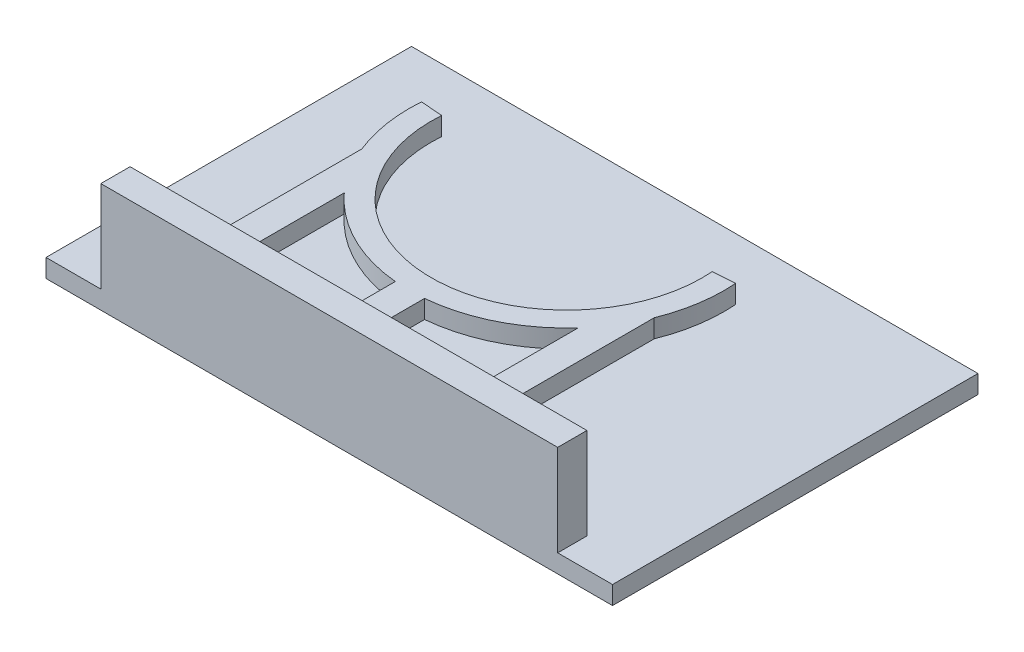
ISO-10303-21;
HEADER;
FILE_DESCRIPTION(('STEP AP214'),'2;1');
FILE_NAME('part.step','',(''),(''),'','','');
FILE_SCHEMA(('AUTOMOTIVE_DESIGN { 1 0 10303 214 1 1 1 1 }'));
ENDSEC;
DATA;
#1=APPLICATION_CONTEXT('core data for automotive mechanical design processes');
#2=APPLICATION_PROTOCOL_DEFINITION('international standard','automotive_design',2000,#1);
#3=PRODUCT_CONTEXT('',#1,'mechanical');
#4=PRODUCT('Part','Part','',(#3));
#5=PRODUCT_RELATED_PRODUCT_CATEGORY('part','',(#4));
#6=PRODUCT_DEFINITION_FORMATION('','',#4);
#7=PRODUCT_DEFINITION_CONTEXT('part definition',#1,'design');
#8=PRODUCT_DEFINITION('design','',#6,#7);
#9=PRODUCT_DEFINITION_SHAPE('','',#8);
#10=(LENGTH_UNIT() NAMED_UNIT(*) SI_UNIT(.MILLI.,.METRE.));
#11=(NAMED_UNIT(*) PLANE_ANGLE_UNIT() SI_UNIT($,.RADIAN.));
#12=(NAMED_UNIT(*) SI_UNIT($,.STERADIAN.) SOLID_ANGLE_UNIT());
#13=UNCERTAINTY_MEASURE_WITH_UNIT(LENGTH_MEASURE(1.E-05),#10,'distance_accuracy_value','');
#14=(GEOMETRIC_REPRESENTATION_CONTEXT(3) GLOBAL_UNCERTAINTY_ASSIGNED_CONTEXT((#13)) GLOBAL_UNIT_ASSIGNED_CONTEXT((#10,
#11,#12)) REPRESENTATION_CONTEXT('',''));
#15=CARTESIAN_POINT('',(0.,0.,0.));
#16=DIRECTION('',(0.,0.,1.));
#17=DIRECTION('',(1.,0.,0.));
#18=AXIS2_PLACEMENT_3D('',#15,#16,#17);
#19=CARTESIAN_POINT('',(77.4999999999999,25.,-65.));
#20=DIRECTION('',(0.,-1.,0.));
#21=DIRECTION('',(0.,0.,-1.));
#22=AXIS2_PLACEMENT_3D('',#19,#20,#21);
#23=CYLINDRICAL_SURFACE('',#22,43.1123422402481);
#24=DIRECTION('',(0.,-1.,0.));
#25=VECTOR('',#24,1.);
#26=CARTESIAN_POINT('',(81.4999999999999,25.,-22.073620541207));
#27=LINE('',#26,#25);
#28=CARTESIAN_POINT('',(81.4999999999999,25.,-22.073620541207));
#29=VERTEX_POINT('',#28);
#30=CARTESIAN_POINT('',(81.4999999999999,20.,-22.0736205412209));
#31=VERTEX_POINT('',#30);
#32=EDGE_CURVE('E282',#29,#31,#27,.T.);
#33=ORIENTED_EDGE('',*,*,#32,.T.);
#34=CARTESIAN_POINT('',(77.4999999999999,20.,-65.));
#35=DIRECTION('',(0.,1.,0.));
#36=DIRECTION('',(0.,0.,1.));
#37=AXIS2_PLACEMENT_3D('',#34,#35,#36);
#38=CIRCLE('',#37,43.1123422402481);
#39=CARTESIAN_POINT('',(109.499999999975,20.,-36.1092739198057));
#40=VERTEX_POINT('',#39);
#41=EDGE_CURVE('E218',#31,#40,#38,.T.);
#42=ORIENTED_EDGE('',*,*,#41,.T.);
#43=DIRECTION('',(0.,-1.,0.));
#44=VECTOR('',#43,1.);
#45=CARTESIAN_POINT('',(109.499999999975,25.,-36.1092739197878));
#46=LINE('',#45,#44);
#47=CARTESIAN_POINT('',(109.499999999975,25.,-36.1092739197878));
#48=VERTEX_POINT('',#47);
#49=EDGE_CURVE('E230',#40,#48,#46,.F.);
#50=ORIENTED_EDGE('',*,*,#49,.T.);
#51=CARTESIAN_POINT('',(77.4999999999999,25.,-65.));
#52=DIRECTION('',(0.,1.,0.));
#53=DIRECTION('',(0.,0.,1.));
#54=AXIS2_PLACEMENT_3D('',#51,#52,#53);
#55=CIRCLE('',#54,43.1123422402481);
#56=EDGE_CURVE('E301',#29,#48,#55,.T.);
#57=ORIENTED_EDGE('',*,*,#56,.F.);
#58=EDGE_LOOP('',(#33,#42,#50,#57));
#59=FACE_BOUND('',#58,.T.);
#60=ADVANCED_FACE('F41',(#59),#23,.T.);
#61=DIRECTION('',(0.,-1.,0.));
#62=VECTOR('',#61,1.);
#63=CARTESIAN_POINT('',(117.499999999975,25.,-48.9166529154456));
#64=LINE('',#63,#62);
#65=CARTESIAN_POINT('',(117.499999999975,25.,-48.9166529154456));
#66=VERTEX_POINT('',#65);
#67=CARTESIAN_POINT('',(117.499999999975,20.,-48.9166529154659));
#68=VERTEX_POINT('',#67);
#69=EDGE_CURVE('E223',#66,#68,#64,.T.);
#70=ORIENTED_EDGE('',*,*,#69,.T.);
#71=CARTESIAN_POINT('',(120.49159792965,20.,-68.224369844725));
#72=VERTEX_POINT('',#71);
#73=EDGE_CURVE('E203',#68,#72,#38,.T.);
#74=ORIENTED_EDGE('',*,*,#73,.T.);
#75=DIRECTION('',(0.,-1.,0.));
#76=VECTOR('',#75,1.);
#77=CARTESIAN_POINT('',(120.49159792965,25.,-68.224369844725));
#78=LINE('',#77,#76);
#79=CARTESIAN_POINT('',(120.49159792965,25.,-68.224369844725));
#80=VERTEX_POINT('',#79);
#81=EDGE_CURVE('E316',#80,#72,#78,.T.);
#82=ORIENTED_EDGE('',*,*,#81,.F.);
#83=EDGE_CURVE('E229',#66,#80,#55,.T.);
#84=ORIENTED_EDGE('',*,*,#83,.F.);
#85=EDGE_LOOP('',(#70,#74,#82,#84));
#86=FACE_BOUND('',#85,.T.);
#87=ADVANCED_FACE('F228',(#86),#23,.T.);
#88=DIRECTION('',(0.,-1.,0.));
#89=VECTOR('',#88,1.);
#90=CARTESIAN_POINT('',(34.5084020703496,25.,-68.224369844725));
#91=LINE('',#90,#89);
#92=CARTESIAN_POINT('',(34.5084020703496,25.,-68.224369844725));
#93=VERTEX_POINT('',#92);
#94=CARTESIAN_POINT('',(34.5084020703496,20.,-68.224369844725));
#95=VERTEX_POINT('',#94);
#96=EDGE_CURVE('E307',#93,#95,#91,.T.);
#97=ORIENTED_EDGE('',*,*,#96,.T.);
#98=CARTESIAN_POINT('',(37.4999999999999,20.,-48.9166529155065));
#99=VERTEX_POINT('',#98);
#100=EDGE_CURVE('E58',#95,#99,#38,.T.);
#101=ORIENTED_EDGE('',*,*,#100,.T.);
#102=DIRECTION('',(0.,-1.,0.));
#103=VECTOR('',#102,1.);
#104=CARTESIAN_POINT('',(37.4999999999999,25.,-48.9166529155065));
#105=LINE('',#104,#103);
#106=CARTESIAN_POINT('',(37.4999999999999,25.0000000000313,-48.9166529155065));
#107=VERTEX_POINT('',#106);
#108=EDGE_CURVE('E260',#99,#107,#105,.F.);
#109=ORIENTED_EDGE('',*,*,#108,.T.);
#110=EDGE_CURVE('E296',#93,#107,#55,.T.);
#111=ORIENTED_EDGE('',*,*,#110,.F.);
#112=EDGE_LOOP('',(#97,#101,#109,#111));
#113=FACE_BOUND('',#112,.T.);
#114=ADVANCED_FACE('F446',(#113),#23,.T.);
#115=CARTESIAN_POINT('',(14.9999999999999,30.,-8.));
#116=DIRECTION('',(0.,0.,1.));
#117=DIRECTION('',(1.,0.,0.));
#118=AXIS2_PLACEMENT_3D('',#115,#116,#117);
#119=PLANE('',#118);
#120=DIRECTION('',(-1.,0.,0.));
#121=VECTOR('',#120,1.);
#122=CARTESIAN_POINT('',(117.499999999975,20.,-8.));
#123=LINE('',#122,#121);
#124=CARTESIAN_POINT('',(117.499999999975,20.,-8.));
#125=VERTEX_POINT('',#124);
#126=CARTESIAN_POINT('',(109.499999999975,20.,-8.));
#127=VERTEX_POINT('',#126);
#128=EDGE_CURVE('E479',#125,#127,#123,.T.);
#129=ORIENTED_EDGE('',*,*,#128,.F.);
#130=DIRECTION('',(0.,-1.,0.));
#131=VECTOR('',#130,1.);
#132=CARTESIAN_POINT('',(117.499999999975,25.,-8.));
#133=LINE('',#132,#131);
#134=CARTESIAN_POINT('',(117.499999999975,25.,-8.));
#135=VERTEX_POINT('',#134);
#136=EDGE_CURVE('E225',#135,#125,#133,.T.);
#137=ORIENTED_EDGE('',*,*,#136,.F.);
#138=DIRECTION('',(1.,0.,0.));
#139=VECTOR('',#138,1.);
#140=CARTESIAN_POINT('',(117.499999999975,25.,-8.));
#141=LINE('',#140,#139);
#142=CARTESIAN_POINT('',(109.499999999975,25.,-8.));
#143=VERTEX_POINT('',#142);
#144=EDGE_CURVE('E66',#143,#135,#141,.T.);
#145=ORIENTED_EDGE('',*,*,#144,.F.);
#146=DIRECTION('',(0.,1.,0.));
#147=VECTOR('',#146,1.);
#148=CARTESIAN_POINT('',(109.499999999975,25.,-8.));
#149=LINE('',#148,#147);
#150=EDGE_CURVE('E481',#127,#143,#149,.T.);
#151=ORIENTED_EDGE('',*,*,#150,.F.);
#152=EDGE_LOOP('',(#129,#137,#145,#151));
#153=FACE_BOUND('',#152,.T.);
#154=DIRECTION('',(-1.,0.,0.));
#155=VECTOR('',#154,1.);
#156=CARTESIAN_POINT('',(81.4999999999999,20.,-8.));
#157=LINE('',#156,#155);
#158=CARTESIAN_POINT('',(81.4999999999999,20.,-8.));
#159=VERTEX_POINT('',#158);
#160=CARTESIAN_POINT('',(73.4999999999999,20.,-8.));
#161=VERTEX_POINT('',#160);
#162=EDGE_CURVE('E267',#159,#161,#157,.T.);
#163=ORIENTED_EDGE('',*,*,#162,.F.);
#164=DIRECTION('',(0.,-1.,0.));
#165=VECTOR('',#164,1.);
#166=CARTESIAN_POINT('',(81.4999999999999,25.,-8.));
#167=LINE('',#166,#165);
#168=CARTESIAN_POINT('',(81.4999999999999,25.,-8.));
#169=VERTEX_POINT('',#168);
#170=EDGE_CURVE('E264',#169,#159,#167,.T.);
#171=ORIENTED_EDGE('',*,*,#170,.F.);
#172=DIRECTION('',(1.,0.,0.));
#173=VECTOR('',#172,1.);
#174=CARTESIAN_POINT('',(81.4999999999999,25.,-8.));
#175=LINE('',#174,#173);
#176=CARTESIAN_POINT('',(73.4999999999999,25.,-8.));
#177=VERTEX_POINT('',#176);
#178=EDGE_CURVE('E273',#177,#169,#175,.T.);
#179=ORIENTED_EDGE('',*,*,#178,.F.);
#180=DIRECTION('',(0.,1.,0.));
#181=VECTOR('',#180,1.);
#182=CARTESIAN_POINT('',(73.4999999999999,25.,-8.));
#183=LINE('',#182,#181);
#184=EDGE_CURVE('E270',#161,#177,#183,.T.);
#185=ORIENTED_EDGE('',*,*,#184,.F.);
#186=EDGE_LOOP('',(#163,#171,#179,#185));
#187=FACE_BOUND('',#186,.T.);
#188=DIRECTION('',(-1.,0.,0.));
#189=VECTOR('',#188,1.);
#190=CARTESIAN_POINT('',(37.4999999999999,20.,-8.));
#191=LINE('',#190,#189);
#192=CARTESIAN_POINT('',(45.5000000000554,20.,-8.));
#193=VERTEX_POINT('',#192);
#194=CARTESIAN_POINT('',(37.4999999999999,20.,-8.));
#195=VERTEX_POINT('',#194);
#196=EDGE_CURVE('E244',#193,#195,#191,.T.);
#197=ORIENTED_EDGE('',*,*,#196,.F.);
#198=DIRECTION('',(0.,-1.,0.));
#199=VECTOR('',#198,1.);
#200=CARTESIAN_POINT('',(45.5000000000554,25.0000000000313,-8.));
#201=LINE('',#200,#199);
#202=CARTESIAN_POINT('',(45.5000000000554,25.0000000000313,-8.));
#203=VERTEX_POINT('',#202);
#204=EDGE_CURVE('E241',#203,#193,#201,.T.);
#205=ORIENTED_EDGE('',*,*,#204,.F.);
#206=DIRECTION('',(1.,0.,0.));
#207=VECTOR('',#206,1.);
#208=CARTESIAN_POINT('',(37.4999999999999,25.0000000000313,-8.));
#209=LINE('',#208,#207);
#210=CARTESIAN_POINT('',(37.4999999999999,25.0000000000313,-8.));
#211=VERTEX_POINT('',#210);
#212=EDGE_CURVE('E237',#211,#203,#209,.T.);
#213=ORIENTED_EDGE('',*,*,#212,.F.);
#214=DIRECTION('',(0.,1.,0.));
#215=VECTOR('',#214,1.);
#216=CARTESIAN_POINT('',(37.4999999999999,25.0000000000313,-8.));
#217=LINE('',#216,#215);
#218=EDGE_CURVE('E233',#195,#211,#217,.T.);
#219=ORIENTED_EDGE('',*,*,#218,.F.);
#220=EDGE_LOOP('',(#197,#205,#213,#219));
#221=FACE_BOUND('',#220,.T.);
#222=DIRECTION('',(0.,-1.,0.));
#223=VECTOR('',#222,1.);
#224=CARTESIAN_POINT('',(140.,30.,-8.));
#225=LINE('',#224,#223);
#226=CARTESIAN_POINT('',(140.,30.,-8.));
#227=VERTEX_POINT('',#226);
#228=CARTESIAN_POINT('',(140.,5.,-8.));
#229=VERTEX_POINT('',#228);
#230=EDGE_CURVE('E338',#227,#229,#225,.T.);
#231=ORIENTED_EDGE('',*,*,#230,.T.);
#232=DIRECTION('',(-1.,0.,0.));
#233=VECTOR('',#232,1.);
#234=CARTESIAN_POINT('',(14.9999999999999,5.,-8.));
#235=LINE('',#234,#233);
#236=CARTESIAN_POINT('',(14.9999999999999,5.,-8.));
#237=VERTEX_POINT('',#236);
#238=EDGE_CURVE('E323',#229,#237,#235,.T.);
#239=ORIENTED_EDGE('',*,*,#238,.T.);
#240=DIRECTION('',(0.,-1.,0.));
#241=VECTOR('',#240,1.);
#242=CARTESIAN_POINT('',(14.9999999999999,30.,-8.));
#243=LINE('',#242,#241);
#244=CARTESIAN_POINT('',(14.9999999999999,30.,-8.));
#245=VERTEX_POINT('',#244);
#246=EDGE_CURVE('E329',#245,#237,#243,.T.);
#247=ORIENTED_EDGE('',*,*,#246,.F.);
#248=DIRECTION('',(-1.,0.,0.));
#249=VECTOR('',#248,1.);
#250=CARTESIAN_POINT('',(14.9999999999999,30.,-8.));
#251=LINE('',#250,#249);
#252=EDGE_CURVE('E327',#227,#245,#251,.T.);
#253=ORIENTED_EDGE('',*,*,#252,.F.);
#254=EDGE_LOOP('',(#231,#239,#247,#253));
#255=FACE_BOUND('',#254,.T.);
#256=ADVANCED_FACE('F451',(#153,#187,#221,#255),#119,.F.);
#257=DIRECTION('',(0.,-1.,0.));
#258=VECTOR('',#257,1.);
#259=CARTESIAN_POINT('',(45.5000000000554,25.,-36.1092739197535));
#260=LINE('',#259,#258);
#261=CARTESIAN_POINT('',(45.5000000000554,25.,-36.1092739197535));
#262=VERTEX_POINT('',#261);
#263=CARTESIAN_POINT('',(45.5000000000554,20.,-36.1092739197488));
#264=VERTEX_POINT('',#263);
#265=EDGE_CURVE('E261',#262,#264,#260,.T.);
#266=ORIENTED_EDGE('',*,*,#265,.T.);
#267=CARTESIAN_POINT('',(73.4999999999986,20.,-22.0736205412071));
#268=VERTEX_POINT('',#267);
#269=EDGE_CURVE('E475',#264,#268,#38,.T.);
#270=ORIENTED_EDGE('',*,*,#269,.T.);
#271=DIRECTION('',(0.,-1.,0.));
#272=VECTOR('',#271,1.);
#273=CARTESIAN_POINT('',(73.4999999999999,25.,-22.073620541207));
#274=LINE('',#273,#272);
#275=CARTESIAN_POINT('',(73.4999999999999,25.,-22.073620541207));
#276=VERTEX_POINT('',#275);
#277=EDGE_CURVE('E291',#268,#276,#274,.F.);
#278=ORIENTED_EDGE('',*,*,#277,.T.);
#279=EDGE_CURVE('E300',#262,#276,#55,.T.);
#280=ORIENTED_EDGE('',*,*,#279,.F.);
#281=EDGE_LOOP('',(#266,#270,#278,#280));
#282=FACE_BOUND('',#281,.T.);
#283=ADVANCED_FACE('F442',(#282),#23,.T.);
#284=CARTESIAN_POINT('',(0.,5.,0.));
#285=DIRECTION('',(0.,-1.,0.));
#286=DIRECTION('',(0.,0.,-1.));
#287=AXIS2_PLACEMENT_3D('',#284,#285,#286);
#288=PLANE('',#287);
#289=DIRECTION('',(0.,0.,1.));
#290=VECTOR('',#289,1.);
#291=CARTESIAN_POINT('',(14.9999999999999,5.,0.));
#292=LINE('',#291,#290);
#293=CARTESIAN_POINT('',(14.9999999999999,5.,0.));
#294=VERTEX_POINT('',#293);
#295=EDGE_CURVE('E318',#237,#294,#292,.T.);
#296=ORIENTED_EDGE('',*,*,#295,.F.);
#297=ORIENTED_EDGE('',*,*,#238,.F.);
#298=DIRECTION('',(0.,0.,-1.));
#299=VECTOR('',#298,1.);
#300=CARTESIAN_POINT('',(140.,5.,0.));
#301=LINE('',#300,#299);
#302=CARTESIAN_POINT('',(140.,5.,0.));
#303=VERTEX_POINT('',#302);
#304=EDGE_CURVE('E332',#303,#229,#301,.T.);
#305=ORIENTED_EDGE('',*,*,#304,.F.);
#306=DIRECTION('',(1.,0.,0.));
#307=VECTOR('',#306,1.);
#308=CARTESIAN_POINT('',(0.,5.,0.));
#309=LINE('',#308,#307);
#310=CARTESIAN_POINT('',(155.,5.,0.));
#311=VERTEX_POINT('',#310);
#312=EDGE_CURVE('E350',#303,#311,#309,.T.);
#313=ORIENTED_EDGE('',*,*,#312,.T.);
#314=DIRECTION('',(0.,0.,-1.));
#315=VECTOR('',#314,1.);
#316=CARTESIAN_POINT('',(155.,5.,0.));
#317=LINE('',#316,#315);
#318=CARTESIAN_POINT('',(155.,5.,-100.));
#319=VERTEX_POINT('',#318);
#320=EDGE_CURVE('E354',#311,#319,#317,.T.);
#321=ORIENTED_EDGE('',*,*,#320,.T.);
#322=DIRECTION('',(-1.,0.,0.));
#323=VECTOR('',#322,1.);
#324=CARTESIAN_POINT('',(0.,5.,-100.));
#325=LINE('',#324,#323);
#326=CARTESIAN_POINT('',(0.,5.,-100.));
#327=VERTEX_POINT('',#326);
#328=EDGE_CURVE('E356',#319,#327,#325,.T.);
#329=ORIENTED_EDGE('',*,*,#328,.T.);
#330=DIRECTION('',(0.,0.,1.));
#331=VECTOR('',#330,1.);
#332=CARTESIAN_POINT('',(0.,5.,0.));
#333=LINE('',#332,#331);
#334=CARTESIAN_POINT('',(0.,5.,0.));
#335=VERTEX_POINT('',#334);
#336=EDGE_CURVE('E347',#327,#335,#333,.T.);
#337=ORIENTED_EDGE('',*,*,#336,.T.);
#338=EDGE_CURVE('E352',#335,#294,#309,.T.);
#339=ORIENTED_EDGE('',*,*,#338,.T.);
#340=EDGE_LOOP('',(#296,#297,#305,#313,#321,#329,#337,#339));
#341=FACE_BOUND('',#340,.T.);
#342=ADVANCED_FACE('F450',(#341),#288,.F.);
#343=CARTESIAN_POINT('',(0.,5.,0.));
#344=DIRECTION('',(1.,0.,0.));
#345=DIRECTION('',(0.,0.,-1.));
#346=AXIS2_PLACEMENT_3D('',#343,#344,#345);
#347=PLANE('',#346);
#348=DIRECTION('',(0.,0.,1.));
#349=VECTOR('',#348,1.);
#350=CARTESIAN_POINT('',(0.,0.,0.));
#351=LINE('',#350,#349);
#352=CARTESIAN_POINT('',(0.,0.,-100.));
#353=VERTEX_POINT('',#352);
#354=CARTESIAN_POINT('',(0.,0.,0.));
#355=VERTEX_POINT('',#354);
#356=EDGE_CURVE('E346',#353,#355,#351,.T.);
#357=ORIENTED_EDGE('',*,*,#356,.T.);
#358=DIRECTION('',(0.,-1.,0.));
#359=VECTOR('',#358,1.);
#360=CARTESIAN_POINT('',(0.,5.,0.));
#361=LINE('',#360,#359);
#362=EDGE_CURVE('E11',#335,#355,#361,.T.);
#363=ORIENTED_EDGE('',*,*,#362,.F.);
#364=ORIENTED_EDGE('',*,*,#336,.F.);
#365=DIRECTION('',(0.,-1.,0.));
#366=VECTOR('',#365,1.);
#367=CARTESIAN_POINT('',(0.,5.,-100.));
#368=LINE('',#367,#366);
#369=EDGE_CURVE('E358',#327,#353,#368,.T.);
#370=ORIENTED_EDGE('',*,*,#369,.T.);
#371=EDGE_LOOP('',(#357,#363,#364,#370));
#372=FACE_BOUND('',#371,.T.);
#373=ADVANCED_FACE('F43',(#372),#347,.F.);
#374=CARTESIAN_POINT('',(0.,5.,0.));
#375=DIRECTION('',(0.,0.,-1.));
#376=DIRECTION('',(-1.,0.,0.));
#377=AXIS2_PLACEMENT_3D('',#374,#375,#376);
#378=PLANE('',#377);
#379=DIRECTION('',(1.,0.,0.));
#380=VECTOR('',#379,1.);
#381=CARTESIAN_POINT('',(0.,0.,0.));
#382=LINE('',#381,#380);
#383=CARTESIAN_POINT('',(155.,0.,0.));
#384=VERTEX_POINT('',#383);
#385=EDGE_CURVE('E361',#355,#384,#382,.T.);
#386=ORIENTED_EDGE('',*,*,#385,.T.);
#387=DIRECTION('',(0.,-1.,0.));
#388=VECTOR('',#387,1.);
#389=CARTESIAN_POINT('',(155.,5.,0.));
#390=LINE('',#389,#388);
#391=EDGE_CURVE('E50',#311,#384,#390,.T.);
#392=ORIENTED_EDGE('',*,*,#391,.F.);
#393=ORIENTED_EDGE('',*,*,#312,.F.);
#394=DIRECTION('',(0.,-1.,0.));
#395=VECTOR('',#394,1.);
#396=CARTESIAN_POINT('',(140.,30.,0.));
#397=LINE('',#396,#395);
#398=CARTESIAN_POINT('',(140.,30.,0.));
#399=VERTEX_POINT('',#398);
#400=EDGE_CURVE('E340',#399,#303,#397,.T.);
#401=ORIENTED_EDGE('',*,*,#400,.F.);
#402=DIRECTION('',(1.,0.,0.));
#403=VECTOR('',#402,1.);
#404=CARTESIAN_POINT('',(14.9999999999999,30.,0.));
#405=LINE('',#404,#403);
#406=CARTESIAN_POINT('',(14.9999999999999,30.,0.));
#407=VERTEX_POINT('',#406);
#408=EDGE_CURVE('E322',#407,#399,#405,.T.);
#409=ORIENTED_EDGE('',*,*,#408,.F.);
#410=DIRECTION('',(0.,-1.,0.));
#411=VECTOR('',#410,1.);
#412=CARTESIAN_POINT('',(14.9999999999999,30.,0.));
#413=LINE('',#412,#411);
#414=EDGE_CURVE('E343',#407,#294,#413,.T.);
#415=ORIENTED_EDGE('',*,*,#414,.T.);
#416=ORIENTED_EDGE('',*,*,#338,.F.);
#417=ORIENTED_EDGE('',*,*,#362,.T.);
#418=EDGE_LOOP('',(#386,#392,#393,#401,#409,#415,#416,#417));
#419=FACE_BOUND('',#418,.T.);
#420=ADVANCED_FACE('F665',(#419),#378,.F.);
#421=CARTESIAN_POINT('',(155.,5.,0.));
#422=DIRECTION('',(-1.,0.,0.));
#423=DIRECTION('',(0.,0.,1.));
#424=AXIS2_PLACEMENT_3D('',#421,#422,#423);
#425=PLANE('',#424);
#426=DIRECTION('',(0.,0.,-1.));
#427=VECTOR('',#426,1.);
#428=CARTESIAN_POINT('',(155.,0.,0.));
#429=LINE('',#428,#427);
#430=CARTESIAN_POINT('',(155.,0.,-100.));
#431=VERTEX_POINT('',#430);
#432=EDGE_CURVE('E363',#384,#431,#429,.T.);
#433=ORIENTED_EDGE('',*,*,#432,.T.);
#434=DIRECTION('',(0.,-1.,0.));
#435=VECTOR('',#434,1.);
#436=CARTESIAN_POINT('',(155.,5.,-100.));
#437=LINE('',#436,#435);
#438=EDGE_CURVE('E368',#319,#431,#437,.T.);
#439=ORIENTED_EDGE('',*,*,#438,.F.);
#440=ORIENTED_EDGE('',*,*,#320,.F.);
#441=ORIENTED_EDGE('',*,*,#391,.T.);
#442=EDGE_LOOP('',(#433,#439,#440,#441));
#443=FACE_BOUND('',#442,.T.);
#444=ADVANCED_FACE('F609',(#443),#425,.F.);
#445=CARTESIAN_POINT('',(0.,5.,-100.));
#446=DIRECTION('',(0.,0.,1.));
#447=DIRECTION('',(1.,0.,0.));
#448=AXIS2_PLACEMENT_3D('',#445,#446,#447);
#449=PLANE('',#448);
#450=DIRECTION('',(-1.,0.,0.));
#451=VECTOR('',#450,1.);
#452=CARTESIAN_POINT('',(0.,0.,-100.));
#453=LINE('',#452,#451);
#454=EDGE_CURVE('E351',#431,#353,#453,.T.);
#455=ORIENTED_EDGE('',*,*,#454,.T.);
#456=ORIENTED_EDGE('',*,*,#369,.F.);
#457=ORIENTED_EDGE('',*,*,#328,.F.);
#458=ORIENTED_EDGE('',*,*,#438,.T.);
#459=EDGE_LOOP('',(#455,#456,#457,#458));
#460=FACE_BOUND('',#459,.T.);
#461=ADVANCED_FACE('F604',(#460),#449,.F.);
#462=CARTESIAN_POINT('',(0.,0.,0.));
#463=DIRECTION('',(0.,-1.,0.));
#464=DIRECTION('',(0.,0.,-1.));
#465=AXIS2_PLACEMENT_3D('',#462,#463,#464);
#466=PLANE('',#465);
#467=ORIENTED_EDGE('',*,*,#356,.F.);
#468=ORIENTED_EDGE('',*,*,#454,.F.);
#469=ORIENTED_EDGE('',*,*,#432,.F.);
#470=ORIENTED_EDGE('',*,*,#385,.F.);
#471=EDGE_LOOP('',(#467,#468,#469,#470));
#472=FACE_BOUND('',#471,.T.);
#473=ADVANCED_FACE('F596',(#472),#466,.T.);
#474=CARTESIAN_POINT('',(14.9999999999999,30.,0.));
#475=DIRECTION('',(1.,0.,0.));
#476=DIRECTION('',(0.,0.,-1.));
#477=AXIS2_PLACEMENT_3D('',#474,#475,#476);
#478=PLANE('',#477);
#479=ORIENTED_EDGE('',*,*,#295,.T.);
#480=ORIENTED_EDGE('',*,*,#414,.F.);
#481=DIRECTION('',(0.,0.,1.));
#482=VECTOR('',#481,1.);
#483=CARTESIAN_POINT('',(14.9999999999999,30.,0.));
#484=LINE('',#483,#482);
#485=EDGE_CURVE('E319',#245,#407,#484,.T.);
#486=ORIENTED_EDGE('',*,*,#485,.F.);
#487=ORIENTED_EDGE('',*,*,#246,.T.);
#488=EDGE_LOOP('',(#479,#480,#486,#487));
#489=FACE_BOUND('',#488,.T.);
#490=ADVANCED_FACE('F585',(#489),#478,.F.);
#491=CARTESIAN_POINT('',(140.,30.,0.));
#492=DIRECTION('',(-1.,0.,0.));
#493=DIRECTION('',(0.,0.,1.));
#494=AXIS2_PLACEMENT_3D('',#491,#492,#493);
#495=PLANE('',#494);
#496=ORIENTED_EDGE('',*,*,#304,.T.);
#497=ORIENTED_EDGE('',*,*,#230,.F.);
#498=DIRECTION('',(0.,0.,-1.));
#499=VECTOR('',#498,1.);
#500=CARTESIAN_POINT('',(140.,30.,0.));
#501=LINE('',#500,#499);
#502=EDGE_CURVE('E325',#399,#227,#501,.T.);
#503=ORIENTED_EDGE('',*,*,#502,.F.);
#504=ORIENTED_EDGE('',*,*,#400,.T.);
#505=EDGE_LOOP('',(#496,#497,#503,#504));
#506=FACE_BOUND('',#505,.T.);
#507=ADVANCED_FACE('F580',(#506),#495,.F.);
#508=CARTESIAN_POINT('',(0.,30.,0.));
#509=DIRECTION('',(0.,-1.,0.));
#510=DIRECTION('',(0.,0.,-1.));
#511=AXIS2_PLACEMENT_3D('',#508,#509,#510);
#512=PLANE('',#511);
#513=ORIENTED_EDGE('',*,*,#485,.T.);
#514=ORIENTED_EDGE('',*,*,#408,.T.);
#515=ORIENTED_EDGE('',*,*,#502,.T.);
#516=ORIENTED_EDGE('',*,*,#252,.T.);
#517=EDGE_LOOP('',(#513,#514,#515,#516));
#518=FACE_BOUND('',#517,.T.);
#519=ADVANCED_FACE('F574',(#518),#512,.F.);
#520=CARTESIAN_POINT('',(114.50840207032,25.,-67.775630155275));
#521=DIRECTION('',(0.0747899482416621,0.,0.997199309888454));
#522=DIRECTION('',(0.997199309888454,0.,-0.0747899482416621));
#523=AXIS2_PLACEMENT_3D('',#520,#521,#522);
#524=PLANE('',#523);
#525=ORIENTED_EDGE('',*,*,#81,.T.);
#526=DIRECTION('',(-0.997199309888454,0.,0.0747899482416621));
#527=VECTOR('',#526,1.);
#528=CARTESIAN_POINT('',(114.50840207032,20.,-67.775630155275));
#529=LINE('',#528,#527);
#530=CARTESIAN_POINT('',(114.50840207032,20.,-67.775630155275));
#531=VERTEX_POINT('',#530);
#532=EDGE_CURVE('E211',#72,#531,#529,.T.);
#533=ORIENTED_EDGE('',*,*,#532,.T.);
#534=DIRECTION('',(0.,-1.,0.));
#535=VECTOR('',#534,1.);
#536=CARTESIAN_POINT('',(114.50840207032,25.,-67.775630155275));
#537=LINE('',#536,#535);
#538=CARTESIAN_POINT('',(114.50840207032,25.,-67.775630155275));
#539=VERTEX_POINT('',#538);
#540=EDGE_CURVE('E313',#539,#531,#537,.T.);
#541=ORIENTED_EDGE('',*,*,#540,.F.);
#542=DIRECTION('',(-0.997199309888454,0.,0.0747899482416621));
#543=VECTOR('',#542,1.);
#544=CARTESIAN_POINT('',(114.50840207032,25.,-67.775630155275));
#545=LINE('',#544,#543);
#546=EDGE_CURVE('E299',#80,#539,#545,.T.);
#547=ORIENTED_EDGE('',*,*,#546,.F.);
#548=EDGE_LOOP('',(#525,#533,#541,#547));
#549=FACE_BOUND('',#548,.T.);
#550=ADVANCED_FACE('F502',(#549),#524,.F.);
#551=CARTESIAN_POINT('',(77.4999999999999,25.,-65.));
#552=DIRECTION('',(0.,-1.,0.));
#553=DIRECTION('',(0.,0.,-1.));
#554=AXIS2_PLACEMENT_3D('',#551,#552,#553);
#555=CYLINDRICAL_SURFACE('',#554,37.1123422402481);
#556=ORIENTED_EDGE('',*,*,#540,.T.);
#557=CARTESIAN_POINT('',(77.4999999999999,20.,-65.));
#558=DIRECTION('',(0.,1.,0.));
#559=DIRECTION('',(0.,0.,1.));
#560=AXIS2_PLACEMENT_3D('',#557,#558,#559);
#561=CIRCLE('',#560,37.1123422402481);
#562=CARTESIAN_POINT('',(40.4915979296804,20.,-67.775630155275));
#563=VERTEX_POINT('',#562);
#564=EDGE_CURVE('E473',#531,#563,#561,.F.);
#565=ORIENTED_EDGE('',*,*,#564,.T.);
#566=DIRECTION('',(0.,-1.,0.));
#567=VECTOR('',#566,1.);
#568=CARTESIAN_POINT('',(40.4915979296804,25.,-67.775630155275));
#569=LINE('',#568,#567);
#570=CARTESIAN_POINT('',(40.4915979296804,25.,-67.775630155275));
#571=VERTEX_POINT('',#570);
#572=EDGE_CURVE('E310',#571,#563,#569,.T.);
#573=ORIENTED_EDGE('',*,*,#572,.F.);
#574=CARTESIAN_POINT('',(77.4999999999999,25.,-65.));
#575=DIRECTION('',(0.,-1.,0.));
#576=DIRECTION('',(0.,0.,1.));
#577=AXIS2_PLACEMENT_3D('',#574,#575,#576);
#578=CIRCLE('',#577,37.1123422402481);
#579=EDGE_CURVE('E303',#539,#571,#578,.T.);
#580=ORIENTED_EDGE('',*,*,#579,.F.);
#581=EDGE_LOOP('',(#556,#565,#573,#580));
#582=FACE_BOUND('',#581,.T.);
#583=ADVANCED_FACE('F505',(#582),#555,.F.);
#584=CARTESIAN_POINT('',(34.5084020703496,25.,-68.224369844725));
#585=DIRECTION('',(-0.0747899482416621,0.,0.997199309888454));
#586=DIRECTION('',(0.997199309888454,0.,0.0747899482416621));
#587=AXIS2_PLACEMENT_3D('',#584,#585,#586);
#588=PLANE('',#587);
#589=ORIENTED_EDGE('',*,*,#572,.T.);
#590=DIRECTION('',(-0.997199309888454,0.,-0.0747899482416621));
#591=VECTOR('',#590,1.);
#592=CARTESIAN_POINT('',(34.5084020703496,20.,-68.224369844725));
#593=LINE('',#592,#591);
#594=EDGE_CURVE('E470',#563,#95,#593,.T.);
#595=ORIENTED_EDGE('',*,*,#594,.T.);
#596=ORIENTED_EDGE('',*,*,#96,.F.);
#597=DIRECTION('',(-0.997199309888454,0.,-0.0747899482416621));
#598=VECTOR('',#597,1.);
#599=CARTESIAN_POINT('',(34.5084020703496,25.,-68.224369844725));
#600=LINE('',#599,#598);
#601=EDGE_CURVE('E305',#571,#93,#600,.T.);
#602=ORIENTED_EDGE('',*,*,#601,.F.);
#603=EDGE_LOOP('',(#589,#595,#596,#602));
#604=FACE_BOUND('',#603,.T.);
#605=ADVANCED_FACE('F469',(#604),#588,.F.);
#606=CARTESIAN_POINT('',(77.4999999999999,25.,-65.));
#607=DIRECTION('',(0.,1.,0.));
#608=DIRECTION('',(0.,0.,1.));
#609=AXIS2_PLACEMENT_3D('',#606,#607,#608);
#610=PLANE('',#609);
#611=ORIENTED_EDGE('',*,*,#110,.T.);
#612=DIRECTION('',(0.,0.,1.));
#613=VECTOR('',#612,1.);
#614=CARTESIAN_POINT('',(37.4999999999999,25.0000000000313,-500000.));
#615=LINE('',#614,#613);
#616=EDGE_CURVE('E257',#107,#211,#615,.T.);
#617=ORIENTED_EDGE('',*,*,#616,.T.);
#618=ORIENTED_EDGE('',*,*,#212,.T.);
#619=DIRECTION('',(0.,0.,1.));
#620=VECTOR('',#619,1.);
#621=CARTESIAN_POINT('',(45.5000000000554,25.0000000000313,-500000.));
#622=LINE('',#621,#620);
#623=EDGE_CURVE('E254',#262,#203,#622,.T.);
#624=ORIENTED_EDGE('',*,*,#623,.F.);
#625=ORIENTED_EDGE('',*,*,#279,.T.);
#626=DIRECTION('',(0.,0.,1.));
#627=VECTOR('',#626,1.);
#628=CARTESIAN_POINT('',(73.4999999999999,25.,-500000.));
#629=LINE('',#628,#627);
#630=EDGE_CURVE('E286',#276,#177,#629,.T.);
#631=ORIENTED_EDGE('',*,*,#630,.T.);
#632=ORIENTED_EDGE('',*,*,#178,.T.);
#633=DIRECTION('',(0.,0.,1.));
#634=VECTOR('',#633,1.);
#635=CARTESIAN_POINT('',(81.4999999999999,25.,-500000.));
#636=LINE('',#635,#634);
#637=EDGE_CURVE('E276',#29,#169,#636,.T.);
#638=ORIENTED_EDGE('',*,*,#637,.F.);
#639=ORIENTED_EDGE('',*,*,#56,.T.);
#640=DIRECTION('',(0.,0.,1.));
#641=VECTOR('',#640,1.);
#642=CARTESIAN_POINT('',(109.499999999975,25.,-500000.));
#643=LINE('',#642,#641);
#644=EDGE_CURVE('E489',#48,#143,#643,.T.);
#645=ORIENTED_EDGE('',*,*,#644,.T.);
#646=ORIENTED_EDGE('',*,*,#144,.T.);
#647=DIRECTION('',(0.,0.,1.));
#648=VECTOR('',#647,1.);
#649=CARTESIAN_POINT('',(117.499999999975,25.,-500000.));
#650=LINE('',#649,#648);
#651=EDGE_CURVE('E484',#66,#135,#650,.T.);
#652=ORIENTED_EDGE('',*,*,#651,.F.);
#653=ORIENTED_EDGE('',*,*,#83,.T.);
#654=ORIENTED_EDGE('',*,*,#546,.T.);
#655=ORIENTED_EDGE('',*,*,#579,.T.);
#656=ORIENTED_EDGE('',*,*,#601,.T.);
#657=EDGE_LOOP('',(#611,#617,#618,#624,#625,#631,#632,#638,#639,#645,#646,#652,#653,#654,#655,#656));
#658=FACE_BOUND('',#657,.T.);
#659=ADVANCED_FACE('F406',(#658),#610,.T.);
#660=CARTESIAN_POINT('',(73.4999999999999,25.,-500000.));
#661=DIRECTION('',(1.,0.,0.));
#662=DIRECTION('',(0.,0.,-1.));
#663=AXIS2_PLACEMENT_3D('',#660,#661,#662);
#664=PLANE('',#663);
#665=ORIENTED_EDGE('',*,*,#277,.F.);
#666=DIRECTION('',(0.,0.,1.));
#667=VECTOR('',#666,1.);
#668=CARTESIAN_POINT('',(73.4999999999999,20.,-500000.));
#669=LINE('',#668,#667);
#670=EDGE_CURVE('E283',#268,#161,#669,.T.);
#671=ORIENTED_EDGE('',*,*,#670,.T.);
#672=ORIENTED_EDGE('',*,*,#184,.T.);
#673=ORIENTED_EDGE('',*,*,#630,.F.);
#674=EDGE_LOOP('',(#665,#671,#672,#673));
#675=FACE_BOUND('',#674,.T.);
#676=ADVANCED_FACE('F516',(#675),#664,.F.);
#677=CARTESIAN_POINT('',(81.4999999999999,25.,-500000.));
#678=DIRECTION('',(-1.,0.,0.));
#679=DIRECTION('',(0.,0.,1.));
#680=AXIS2_PLACEMENT_3D('',#677,#678,#679);
#681=PLANE('',#680);
#682=ORIENTED_EDGE('',*,*,#32,.F.);
#683=ORIENTED_EDGE('',*,*,#637,.T.);
#684=ORIENTED_EDGE('',*,*,#170,.T.);
#685=DIRECTION('',(0.,0.,1.));
#686=VECTOR('',#685,1.);
#687=CARTESIAN_POINT('',(81.4999999999999,20.,-500000.));
#688=LINE('',#687,#686);
#689=EDGE_CURVE('E279',#31,#159,#688,.T.);
#690=ORIENTED_EDGE('',*,*,#689,.F.);
#691=EDGE_LOOP('',(#682,#683,#684,#690));
#692=FACE_BOUND('',#691,.T.);
#693=ADVANCED_FACE('F404',(#692),#681,.F.);
#694=CARTESIAN_POINT('',(81.4999999999999,20.,-500000.));
#695=DIRECTION('',(0.,1.,0.));
#696=DIRECTION('',(0.,0.,1.));
#697=AXIS2_PLACEMENT_3D('',#694,#695,#696);
#698=PLANE('',#697);
#699=CARTESIAN_POINT('',(117.5,20.,-65.0000000000001));
#700=DIRECTION('',(0.,1.,0.));
#701=DIRECTION('',(0.,0.,1.));
#702=AXIS2_PLACEMENT_3D('',#699,#700,#701);
#703=CIRCLE('',#702,2.23606797749979);
#704=CARTESIAN_POINT('',(117.5,20.,-62.7639320225003));
#705=VERTEX_POINT('',#704);
#706=EDGE_CURVE('E45',#705,#705,#703,.F.);
#707=ORIENTED_EDGE('',*,*,#706,.F.);
#708=EDGE_LOOP('',(#707));
#709=FACE_BOUND('',#708,.T.);
#710=CARTESIAN_POINT('',(114.455181300451,20.,-49.6926627053965));
#711=DIRECTION('',(0.,1.,0.));
#712=DIRECTION('',(0.,0.,1.));
#713=AXIS2_PLACEMENT_3D('',#710,#711,#712);
#714=CIRCLE('',#713,2.23606797749979);
#715=CARTESIAN_POINT('',(114.455181300451,20.,-47.4565947278967));
#716=VERTEX_POINT('',#715);
#717=EDGE_CURVE('E392',#716,#716,#714,.F.);
#718=ORIENTED_EDGE('',*,*,#717,.F.);
#719=EDGE_LOOP('',(#718));
#720=FACE_BOUND('',#719,.T.);
#721=CARTESIAN_POINT('',(105.784271247462,20.,-36.7157287525381));
#722=DIRECTION('',(0.,1.,0.));
#723=DIRECTION('',(0.,0.,1.));
#724=AXIS2_PLACEMENT_3D('',#721,#722,#723);
#725=CIRCLE('',#724,2.23606797749979);
#726=CARTESIAN_POINT('',(105.784271247462,20.,-34.4796607750383));
#727=VERTEX_POINT('',#726);
#728=EDGE_CURVE('E390',#727,#727,#725,.F.);
#729=ORIENTED_EDGE('',*,*,#728,.F.);
#730=EDGE_LOOP('',(#729));
#731=FACE_BOUND('',#730,.T.);
#732=CARTESIAN_POINT('',(92.8073372946036,20.,-28.0448186995485));
#733=DIRECTION('',(0.,1.,0.));
#734=DIRECTION('',(0.,0.,1.));
#735=AXIS2_PLACEMENT_3D('',#732,#733,#734);
#736=CIRCLE('',#735,2.23606797749979);
#737=CARTESIAN_POINT('',(92.8073372946036,20.,-25.8087507220487));
#738=VERTEX_POINT('',#737);
#739=EDGE_CURVE('E387',#738,#738,#736,.F.);
#740=ORIENTED_EDGE('',*,*,#739,.F.);
#741=EDGE_LOOP('',(#740));
#742=FACE_BOUND('',#741,.T.);
#743=CARTESIAN_POINT('',(37.4999999999999,20.,-65.0000000000001));
#744=DIRECTION('',(0.,1.,0.));
#745=DIRECTION('',(0.,0.,1.));
#746=AXIS2_PLACEMENT_3D('',#743,#744,#745);
#747=CIRCLE('',#746,2.23606797749979);
#748=CARTESIAN_POINT('',(37.4999999999999,20.,-62.7639320225003));
#749=VERTEX_POINT('',#748);
#750=EDGE_CURVE('E384',#749,#749,#747,.F.);
#751=ORIENTED_EDGE('',*,*,#750,.F.);
#752=EDGE_LOOP('',(#751));
#753=FACE_BOUND('',#752,.T.);
#754=CARTESIAN_POINT('',(40.5448186995484,20.,-49.6926627053965));
#755=DIRECTION('',(0.,1.,0.));
#756=DIRECTION('',(0.,0.,1.));
#757=AXIS2_PLACEMENT_3D('',#754,#755,#756);
#758=CIRCLE('',#757,2.23606797749979);
#759=CARTESIAN_POINT('',(40.5448186995484,20.,-47.4565947278967));
#760=VERTEX_POINT('',#759);
#761=EDGE_CURVE('E381',#760,#760,#758,.F.);
#762=ORIENTED_EDGE('',*,*,#761,.F.);
#763=EDGE_LOOP('',(#762));
#764=FACE_BOUND('',#763,.T.);
#765=CARTESIAN_POINT('',(49.215728752538,20.,-36.7157287525381));
#766=DIRECTION('',(0.,1.,0.));
#767=DIRECTION('',(0.,0.,1.));
#768=AXIS2_PLACEMENT_3D('',#765,#766,#767);
#769=CIRCLE('',#768,2.23606797749979);
#770=CARTESIAN_POINT('',(49.215728752538,20.,-34.4796607750383));
#771=VERTEX_POINT('',#770);
#772=EDGE_CURVE('E378',#771,#771,#769,.F.);
#773=ORIENTED_EDGE('',*,*,#772,.F.);
#774=EDGE_LOOP('',(#773));
#775=FACE_BOUND('',#774,.T.);
#776=CARTESIAN_POINT('',(62.1926627053963,20.,-28.0448186995485));
#777=DIRECTION('',(0.,1.,0.));
#778=DIRECTION('',(0.,0.,1.));
#779=AXIS2_PLACEMENT_3D('',#776,#777,#778);
#780=CIRCLE('',#779,2.23606797749979);
#781=CARTESIAN_POINT('',(62.1926627053963,20.,-25.8087507220487));
#782=VERTEX_POINT('',#781);
#783=EDGE_CURVE('E375',#782,#782,#780,.F.);
#784=ORIENTED_EDGE('',*,*,#783,.F.);
#785=EDGE_LOOP('',(#784));
#786=FACE_BOUND('',#785,.T.);
#787=CARTESIAN_POINT('',(77.4999999999999,20.,-25.));
#788=DIRECTION('',(0.,1.,0.));
#789=DIRECTION('',(0.,0.,1.));
#790=AXIS2_PLACEMENT_3D('',#787,#788,#789);
#791=CIRCLE('',#790,2.23606797749979);
#792=CARTESIAN_POINT('',(77.4999999999999,20.,-22.7639320225002));
#793=VERTEX_POINT('',#792);
#794=EDGE_CURVE('E216',#793,#793,#791,.F.);
#795=ORIENTED_EDGE('',*,*,#794,.F.);
#796=EDGE_LOOP('',(#795));
#797=FACE_BOUND('',#796,.T.);
#798=ORIENTED_EDGE('',*,*,#670,.F.);
#799=ORIENTED_EDGE('',*,*,#269,.F.);
#800=DIRECTION('',(0.,0.,1.));
#801=VECTOR('',#800,1.);
#802=CARTESIAN_POINT('',(45.5000000000554,20.,-500000.));
#803=LINE('',#802,#801);
#804=EDGE_CURVE('E251',#264,#193,#803,.T.);
#805=ORIENTED_EDGE('',*,*,#804,.T.);
#806=ORIENTED_EDGE('',*,*,#196,.T.);
#807=DIRECTION('',(0.,0.,1.));
#808=VECTOR('',#807,1.);
#809=CARTESIAN_POINT('',(37.4999999999999,20.,-500000.));
#810=LINE('',#809,#808);
#811=EDGE_CURVE('E240',#99,#195,#810,.T.);
#812=ORIENTED_EDGE('',*,*,#811,.F.);
#813=ORIENTED_EDGE('',*,*,#100,.F.);
#814=ORIENTED_EDGE('',*,*,#594,.F.);
#815=ORIENTED_EDGE('',*,*,#564,.F.);
#816=ORIENTED_EDGE('',*,*,#532,.F.);
#817=ORIENTED_EDGE('',*,*,#73,.F.);
#818=DIRECTION('',(0.,0.,1.));
#819=VECTOR('',#818,1.);
#820=CARTESIAN_POINT('',(117.499999999975,20.,-500000.));
#821=LINE('',#820,#819);
#822=EDGE_CURVE('E208',#68,#125,#821,.T.);
#823=ORIENTED_EDGE('',*,*,#822,.T.);
#824=ORIENTED_EDGE('',*,*,#128,.T.);
#825=DIRECTION('',(0.,0.,1.));
#826=VECTOR('',#825,1.);
#827=CARTESIAN_POINT('',(109.499999999975,20.,-500000.));
#828=LINE('',#827,#826);
#829=EDGE_CURVE('E226',#40,#127,#828,.T.);
#830=ORIENTED_EDGE('',*,*,#829,.F.);
#831=ORIENTED_EDGE('',*,*,#41,.F.);
#832=ORIENTED_EDGE('',*,*,#689,.T.);
#833=ORIENTED_EDGE('',*,*,#162,.T.);
#834=EDGE_LOOP('',(#798,#799,#805,#806,#812,#813,#814,#815,#816,#817,#823,#824,#830,#831,#832,#833));
#835=FACE_BOUND('',#834,.T.);
#836=ADVANCED_FACE('F206',(#709,#720,#731,#742,#753,#764,#775,#786,#797,#835),#698,.F.);
#837=CARTESIAN_POINT('',(45.5000000000554,25.0000000000313,-500000.));
#838=DIRECTION('',(-1.,0.,0.));
#839=DIRECTION('',(0.,0.,1.));
#840=AXIS2_PLACEMENT_3D('',#837,#838,#839);
#841=PLANE('',#840);
#842=ORIENTED_EDGE('',*,*,#265,.F.);
#843=ORIENTED_EDGE('',*,*,#623,.T.);
#844=ORIENTED_EDGE('',*,*,#204,.T.);
#845=ORIENTED_EDGE('',*,*,#804,.F.);
#846=EDGE_LOOP('',(#842,#843,#844,#845));
#847=FACE_BOUND('',#846,.T.);
#848=ADVANCED_FACE('F403',(#847),#841,.F.);
#849=CARTESIAN_POINT('',(37.4999999999999,25.0000000000313,-500000.));
#850=DIRECTION('',(1.,0.,0.));
#851=DIRECTION('',(0.,0.,-1.));
#852=AXIS2_PLACEMENT_3D('',#849,#850,#851);
#853=PLANE('',#852);
#854=ORIENTED_EDGE('',*,*,#108,.F.);
#855=ORIENTED_EDGE('',*,*,#811,.T.);
#856=ORIENTED_EDGE('',*,*,#218,.T.);
#857=ORIENTED_EDGE('',*,*,#616,.F.);
#858=EDGE_LOOP('',(#854,#855,#856,#857));
#859=FACE_BOUND('',#858,.T.);
#860=ADVANCED_FACE('F437',(#859),#853,.F.);
#861=CARTESIAN_POINT('',(109.499999999975,25.,-500000.));
#862=DIRECTION('',(1.,0.,0.));
#863=DIRECTION('',(0.,0.,-1.));
#864=AXIS2_PLACEMENT_3D('',#861,#862,#863);
#865=PLANE('',#864);
#866=ORIENTED_EDGE('',*,*,#49,.F.);
#867=ORIENTED_EDGE('',*,*,#829,.T.);
#868=ORIENTED_EDGE('',*,*,#150,.T.);
#869=ORIENTED_EDGE('',*,*,#644,.F.);
#870=EDGE_LOOP('',(#866,#867,#868,#869));
#871=FACE_BOUND('',#870,.T.);
#872=ADVANCED_FACE('F426',(#871),#865,.F.);
#873=CARTESIAN_POINT('',(117.499999999975,25.,-500000.));
#874=DIRECTION('',(-1.,0.,0.));
#875=DIRECTION('',(0.,0.,1.));
#876=AXIS2_PLACEMENT_3D('',#873,#874,#875);
#877=PLANE('',#876);
#878=ORIENTED_EDGE('',*,*,#69,.F.);
#879=ORIENTED_EDGE('',*,*,#651,.T.);
#880=ORIENTED_EDGE('',*,*,#136,.T.);
#881=ORIENTED_EDGE('',*,*,#822,.F.);
#882=EDGE_LOOP('',(#878,#879,#880,#881));
#883=FACE_BOUND('',#882,.T.);
#884=ADVANCED_FACE('F221',(#883),#877,.F.);
#885=CARTESIAN_POINT('',(77.4999999999999,18.,-25.));
#886=DIRECTION('',(-1.,0.,0.));
#887=DIRECTION('',(0.,0.,1.));
#888=AXIS2_PLACEMENT_3D('',#885,#886,#887);
#889=SPHERICAL_SURFACE('',#888,3.);
#890=CARTESIAN_POINT('',(77.4999999999999,18.,-25.));
#891=DIRECTION('',(0.,1.,0.));
#892=DIRECTION('',(0.,0.,1.));
#893=AXIS2_PLACEMENT_3D('',#890,#891,#892);
#894=SPHERICAL_SURFACE('',#893,3.);
#895=ORIENTED_EDGE('',*,*,#794,.T.);
#896=EDGE_LOOP('',(#895));
#897=FACE_BOUND('',#896,.T.);
#898=ADVANCED_FACE('F422',(#897),#894,.F.);
#899=CARTESIAN_POINT('',(62.1926627053963,18.,-28.0448186995485));
#900=DIRECTION('',(-0.923879532511287,0.,-0.382683432365091));
#901=DIRECTION('',(-0.382683432365091,0.,0.923879532511287));
#902=AXIS2_PLACEMENT_3D('',#899,#900,#901);
#903=SPHERICAL_SURFACE('',#902,3.);
#904=CARTESIAN_POINT('',(62.1926627053963,18.,-28.0448186995485));
#905=DIRECTION('',(0.,1.,0.));
#906=DIRECTION('',(0.,0.,1.));
#907=AXIS2_PLACEMENT_3D('',#904,#905,#906);
#908=SPHERICAL_SURFACE('',#907,3.);
#909=ORIENTED_EDGE('',*,*,#783,.T.);
#910=EDGE_LOOP('',(#909));
#911=FACE_BOUND('',#910,.T.);
#912=ADVANCED_FACE('F424',(#911),#908,.F.);
#913=CARTESIAN_POINT('',(49.215728752538,18.,-36.7157287525381));
#914=DIRECTION('',(-0.707106781186546,0.,-0.707106781186549));
#915=DIRECTION('',(-0.707106781186549,0.,0.707106781186546));
#916=AXIS2_PLACEMENT_3D('',#913,#914,#915);
#917=SPHERICAL_SURFACE('',#916,3.);
#918=CARTESIAN_POINT('',(49.215728752538,18.,-36.7157287525381));
#919=DIRECTION('',(0.,1.,0.));
#920=DIRECTION('',(0.,0.,1.));
#921=AXIS2_PLACEMENT_3D('',#918,#919,#920);
#922=SPHERICAL_SURFACE('',#921,3.);
#923=ORIENTED_EDGE('',*,*,#772,.T.);
#924=EDGE_LOOP('',(#923));
#925=FACE_BOUND('',#924,.T.);
#926=ADVANCED_FACE('F431',(#925),#922,.F.);
#927=CARTESIAN_POINT('',(40.5448186995484,18.,-49.6926627053965));
#928=DIRECTION('',(-0.382683432365087,0.,-0.923879532511288));
#929=DIRECTION('',(-0.923879532511288,0.,0.382683432365087));
#930=AXIS2_PLACEMENT_3D('',#927,#928,#929);
#931=SPHERICAL_SURFACE('',#930,3.);
#932=CARTESIAN_POINT('',(40.5448186995484,18.,-49.6926627053965));
#933=DIRECTION('',(0.,1.,0.));
#934=DIRECTION('',(0.,0.,1.));
#935=AXIS2_PLACEMENT_3D('',#932,#933,#934);
#936=SPHERICAL_SURFACE('',#935,3.);
#937=ORIENTED_EDGE('',*,*,#761,.T.);
#938=EDGE_LOOP('',(#937));
#939=FACE_BOUND('',#938,.T.);
#940=ADVANCED_FACE('F747',(#939),#936,.F.);
#941=CARTESIAN_POINT('',(37.4999999999999,18.,-65.0000000000001));
#942=DIRECTION('',(0.,0.,-1.));
#943=DIRECTION('',(-1.,0.,0.));
#944=AXIS2_PLACEMENT_3D('',#941,#942,#943);
#945=SPHERICAL_SURFACE('',#944,3.);
#946=CARTESIAN_POINT('',(37.4999999999999,18.,-65.0000000000001));
#947=DIRECTION('',(0.,1.,0.));
#948=DIRECTION('',(0.,0.,1.));
#949=AXIS2_PLACEMENT_3D('',#946,#947,#948);
#950=SPHERICAL_SURFACE('',#949,3.);
#951=ORIENTED_EDGE('',*,*,#750,.T.);
#952=EDGE_LOOP('',(#951));
#953=FACE_BOUND('',#952,.T.);
#954=ADVANCED_FACE('F756',(#953),#950,.F.);
#955=CARTESIAN_POINT('',(92.8073372946036,18.,-28.0448186995485));
#956=DIRECTION('',(-0.923879532511287,0.,0.382683432365091));
#957=DIRECTION('',(0.382683432365091,0.,0.923879532511287));
#958=AXIS2_PLACEMENT_3D('',#955,#956,#957);
#959=SPHERICAL_SURFACE('',#958,3.);
#960=CARTESIAN_POINT('',(92.8073372946036,18.,-28.0448186995485));
#961=DIRECTION('',(0.,1.,0.));
#962=DIRECTION('',(0.,0.,1.));
#963=AXIS2_PLACEMENT_3D('',#960,#961,#962);
#964=SPHERICAL_SURFACE('',#963,3.);
#965=ORIENTED_EDGE('',*,*,#739,.T.);
#966=EDGE_LOOP('',(#965));
#967=FACE_BOUND('',#966,.T.);
#968=ADVANCED_FACE('F765',(#967),#964,.F.);
#969=CARTESIAN_POINT('',(105.784271247462,18.,-36.7157287525381));
#970=DIRECTION('',(-0.707106781186546,0.,0.707106781186549));
#971=DIRECTION('',(0.707106781186549,0.,0.707106781186546));
#972=AXIS2_PLACEMENT_3D('',#969,#970,#971);
#973=SPHERICAL_SURFACE('',#972,3.);
#974=CARTESIAN_POINT('',(105.784271247462,18.,-36.7157287525381));
#975=DIRECTION('',(0.,1.,0.));
#976=DIRECTION('',(0.,0.,1.));
#977=AXIS2_PLACEMENT_3D('',#974,#975,#976);
#978=SPHERICAL_SURFACE('',#977,3.);
#979=ORIENTED_EDGE('',*,*,#728,.T.);
#980=EDGE_LOOP('',(#979));
#981=FACE_BOUND('',#980,.T.);
#982=ADVANCED_FACE('F774',(#981),#978,.F.);
#983=CARTESIAN_POINT('',(114.455181300451,18.,-49.6926627053965));
#984=DIRECTION('',(-0.382683432365087,0.,0.923879532511288));
#985=DIRECTION('',(0.923879532511288,0.,0.382683432365087));
#986=AXIS2_PLACEMENT_3D('',#983,#984,#985);
#987=SPHERICAL_SURFACE('',#986,3.);
#988=CARTESIAN_POINT('',(114.455181300451,18.,-49.6926627053965));
#989=DIRECTION('',(0.,1.,0.));
#990=DIRECTION('',(0.,0.,1.));
#991=AXIS2_PLACEMENT_3D('',#988,#989,#990);
#992=SPHERICAL_SURFACE('',#991,3.);
#993=ORIENTED_EDGE('',*,*,#717,.T.);
#994=EDGE_LOOP('',(#993));
#995=FACE_BOUND('',#994,.T.);
#996=ADVANCED_FACE('F783',(#995),#992,.F.);
#997=CARTESIAN_POINT('',(117.5,18.,-65.0000000000001));
#998=DIRECTION('',(0.,0.,1.));
#999=DIRECTION('',(1.,0.,0.));
#1000=AXIS2_PLACEMENT_3D('',#997,#998,#999);
#1001=SPHERICAL_SURFACE('',#1000,3.);
#1002=CARTESIAN_POINT('',(117.5,18.,-65.0000000000001));
#1003=DIRECTION('',(0.,1.,0.));
#1004=DIRECTION('',(0.,0.,1.));
#1005=AXIS2_PLACEMENT_3D('',#1002,#1003,#1004);
#1006=SPHERICAL_SURFACE('',#1005,3.);
#1007=ORIENTED_EDGE('',*,*,#706,.T.);
#1008=EDGE_LOOP('',(#1007));
#1009=FACE_BOUND('',#1008,.T.);
#1010=ADVANCED_FACE('F399',(#1009),#1006,.F.);
#1011=CLOSED_SHELL('',(#60,#87,#114,#256,#283,#342,#373,#420,#444,#461,#473,#490,#507,#519,#550,
#583,#605,#659,#676,#693,#836,#848,#860,#872,#884,#898,#912,#926,#940,#954,#968,#982,#996,#1010));
#1012=MANIFOLD_SOLID_BREP('B2',#1011);
#1013=ADVANCED_BREP_SHAPE_REPRESENTATION('',(#18,#1012),#14);
#1014=SHAPE_DEFINITION_REPRESENTATION(#9,#1013);
ENDSEC;
END-ISO-10303-21;
